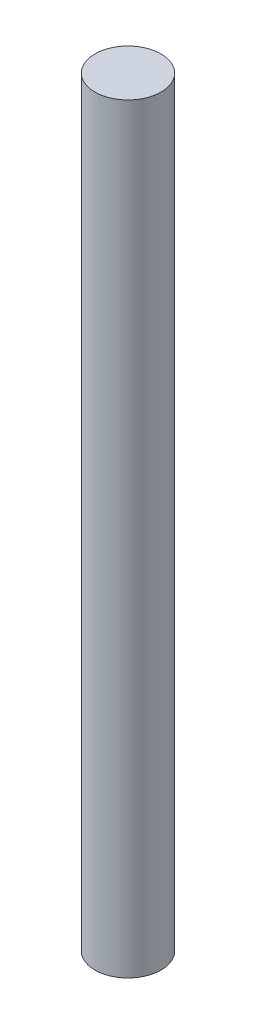
ISO-10303-21;
HEADER;
FILE_DESCRIPTION(('STEP AP214'),'2;1');
FILE_NAME('part.step','',(''),(''),'','','');
FILE_SCHEMA(('AUTOMOTIVE_DESIGN { 1 0 10303 214 1 1 1 1 }'));
ENDSEC;
DATA;
#1=APPLICATION_CONTEXT('core data for automotive mechanical design processes');
#2=APPLICATION_PROTOCOL_DEFINITION('international standard','automotive_design',2000,#1);
#3=PRODUCT_CONTEXT('',#1,'mechanical');
#4=PRODUCT('Part','Part','',(#3));
#5=PRODUCT_RELATED_PRODUCT_CATEGORY('part','',(#4));
#6=PRODUCT_DEFINITION_FORMATION('','',#4);
#7=PRODUCT_DEFINITION_CONTEXT('part definition',#1,'design');
#8=PRODUCT_DEFINITION('design','',#6,#7);
#9=PRODUCT_DEFINITION_SHAPE('','',#8);
#10=(LENGTH_UNIT() NAMED_UNIT(*) SI_UNIT(.MILLI.,.METRE.));
#11=(NAMED_UNIT(*) PLANE_ANGLE_UNIT() SI_UNIT($,.RADIAN.));
#12=(NAMED_UNIT(*) SI_UNIT($,.STERADIAN.) SOLID_ANGLE_UNIT());
#13=UNCERTAINTY_MEASURE_WITH_UNIT(LENGTH_MEASURE(1.E-05),#10,'distance_accuracy_value','');
#14=(GEOMETRIC_REPRESENTATION_CONTEXT(3) GLOBAL_UNCERTAINTY_ASSIGNED_CONTEXT((#13)) GLOBAL_UNIT_ASSIGNED_CONTEXT((#10,
#11,#12)) REPRESENTATION_CONTEXT('',''));
#15=CARTESIAN_POINT('',(0.,0.,0.));
#16=DIRECTION('',(0.,0.,1.));
#17=DIRECTION('',(1.,0.,0.));
#18=AXIS2_PLACEMENT_3D('',#15,#16,#17);
#19=CARTESIAN_POINT('',(0.,230.,0.));
#20=DIRECTION('',(0.,-1.,0.));
#21=DIRECTION('',(0.,0.,-1.));
#22=AXIS2_PLACEMENT_3D('',#19,#20,#21);
#23=CYLINDRICAL_SURFACE('',#22,10.);
#24=CARTESIAN_POINT('',(0.,230.,0.));
#25=DIRECTION('',(0.,1.,0.));
#26=DIRECTION('',(0.,0.,1.));
#27=AXIS2_PLACEMENT_3D('',#24,#25,#26);
#28=CIRCLE('',#27,10.);
#29=CARTESIAN_POINT('',(0.,230.,10.));
#30=VERTEX_POINT('',#29);
#31=EDGE_CURVE('E10',#30,#30,#28,.T.);
#32=ORIENTED_EDGE('',*,*,#31,.F.);
#33=EDGE_LOOP('',(#32));
#34=FACE_BOUND('',#33,.T.);
#35=CARTESIAN_POINT('',(0.,0.,0.));
#36=DIRECTION('',(0.,1.,0.));
#37=DIRECTION('',(0.,0.,1.));
#38=AXIS2_PLACEMENT_3D('',#35,#36,#37);
#39=CIRCLE('',#38,10.);
#40=CARTESIAN_POINT('',(0.,0.,10.));
#41=VERTEX_POINT('',#40);
#42=EDGE_CURVE('E35',#41,#41,#39,.T.);
#43=ORIENTED_EDGE('',*,*,#42,.T.);
#44=EDGE_LOOP('',(#43));
#45=FACE_BOUND('',#44,.T.);
#46=ADVANCED_FACE('F32',(#34,#45),#23,.T.);
#47=CARTESIAN_POINT('',(0.,230.,0.));
#48=DIRECTION('',(0.,1.,0.));
#49=DIRECTION('',(0.,0.,1.));
#50=AXIS2_PLACEMENT_3D('',#47,#48,#49);
#51=PLANE('',#50);
#52=ORIENTED_EDGE('',*,*,#31,.T.);
#53=EDGE_LOOP('',(#52));
#54=FACE_BOUND('',#53,.T.);
#55=ADVANCED_FACE('F47',(#54),#51,.T.);
#56=CARTESIAN_POINT('',(0.,0.,0.));
#57=DIRECTION('',(0.,1.,0.));
#58=DIRECTION('',(0.,0.,1.));
#59=AXIS2_PLACEMENT_3D('',#56,#57,#58);
#60=PLANE('',#59);
#61=ORIENTED_EDGE('',*,*,#42,.F.);
#62=EDGE_LOOP('',(#61));
#63=FACE_BOUND('',#62,.T.);
#64=ADVANCED_FACE('F45',(#63),#60,.F.);
#65=CLOSED_SHELL('',(#46,#55,#64));
#66=MANIFOLD_SOLID_BREP('B2',#65);
#67=ADVANCED_BREP_SHAPE_REPRESENTATION('',(#18,#66),#14);
#68=SHAPE_DEFINITION_REPRESENTATION(#9,#67);
ENDSEC;
END-ISO-10303-21;
